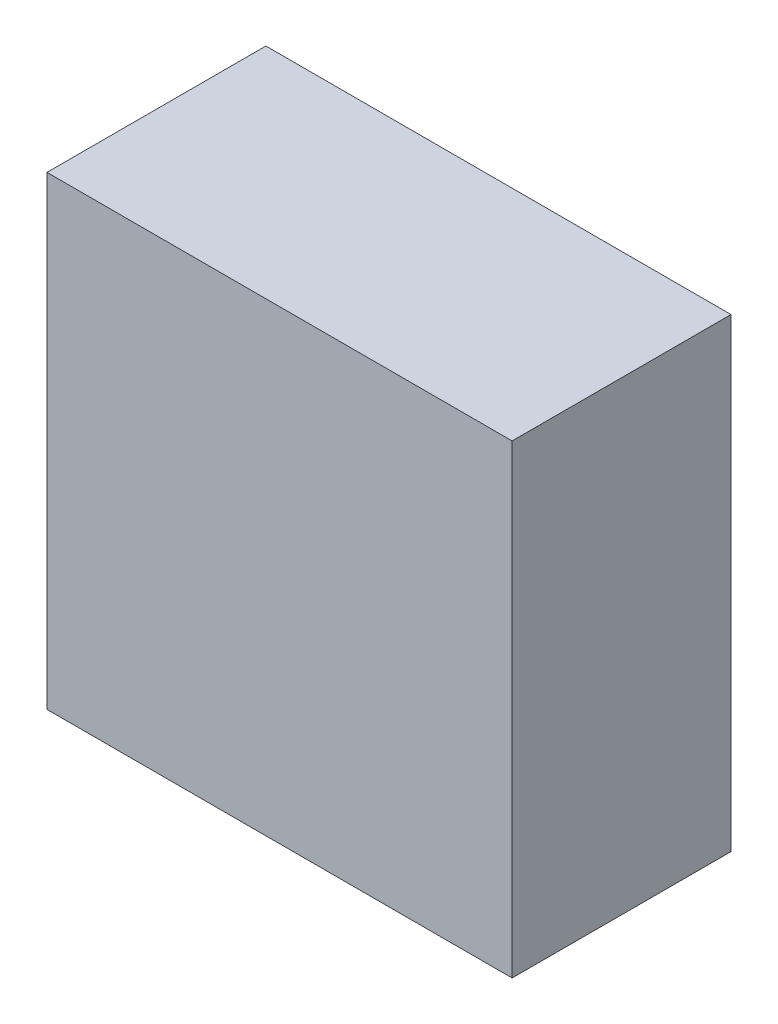
ISO-10303-21;
HEADER;
FILE_DESCRIPTION(('STEP AP214'),'2;1');
FILE_NAME('part.step','',(''),(''),'','','');
FILE_SCHEMA(('AUTOMOTIVE_DESIGN { 1 0 10303 214 1 1 1 1 }'));
ENDSEC;
DATA;
#1=APPLICATION_CONTEXT('core data for automotive mechanical design processes');
#2=APPLICATION_PROTOCOL_DEFINITION('international standard','automotive_design',2000,#1);
#3=PRODUCT_CONTEXT('',#1,'mechanical');
#4=PRODUCT('Part','Part','',(#3));
#5=PRODUCT_RELATED_PRODUCT_CATEGORY('part','',(#4));
#6=PRODUCT_DEFINITION_FORMATION('','',#4);
#7=PRODUCT_DEFINITION_CONTEXT('part definition',#1,'design');
#8=PRODUCT_DEFINITION('design','',#6,#7);
#9=PRODUCT_DEFINITION_SHAPE('','',#8);
#10=(LENGTH_UNIT() NAMED_UNIT(*) SI_UNIT(.MILLI.,.METRE.));
#11=(NAMED_UNIT(*) PLANE_ANGLE_UNIT() SI_UNIT($,.RADIAN.));
#12=(NAMED_UNIT(*) SI_UNIT($,.STERADIAN.) SOLID_ANGLE_UNIT());
#13=UNCERTAINTY_MEASURE_WITH_UNIT(LENGTH_MEASURE(1.E-05),#10,'distance_accuracy_value','');
#14=(GEOMETRIC_REPRESENTATION_CONTEXT(3) GLOBAL_UNCERTAINTY_ASSIGNED_CONTEXT((#13)) GLOBAL_UNIT_ASSIGNED_CONTEXT((#10,
#11,#12)) REPRESENTATION_CONTEXT('',''));
#15=CARTESIAN_POINT('',(0.,0.,0.));
#16=DIRECTION('',(0.,0.,1.));
#17=DIRECTION('',(1.,0.,0.));
#18=AXIS2_PLACEMENT_3D('',#15,#16,#17);
#19=CARTESIAN_POINT('',(-17.,17.,16.));
#20=DIRECTION('',(1.,0.,0.));
#21=DIRECTION('',(0.,0.,-1.));
#22=AXIS2_PLACEMENT_3D('',#19,#20,#21);
#23=PLANE('',#22);
#24=DIRECTION('',(0.,-1.,0.));
#25=VECTOR('',#24,1.);
#26=CARTESIAN_POINT('',(-17.,17.,0.));
#27=LINE('',#26,#25);
#28=CARTESIAN_POINT('',(-17.,17.,0.));
#29=VERTEX_POINT('',#28);
#30=CARTESIAN_POINT('',(-17.,-17.,0.));
#31=VERTEX_POINT('',#30);
#32=EDGE_CURVE('E101',#29,#31,#27,.T.);
#33=ORIENTED_EDGE('',*,*,#32,.T.);
#34=DIRECTION('',(0.,0.,-1.));
#35=VECTOR('',#34,1.);
#36=CARTESIAN_POINT('',(-17.,-17.,16.));
#37=LINE('',#36,#35);
#38=CARTESIAN_POINT('',(-17.,-17.,16.));
#39=VERTEX_POINT('',#38);
#40=EDGE_CURVE('E11',#39,#31,#37,.T.);
#41=ORIENTED_EDGE('',*,*,#40,.F.);
#42=DIRECTION('',(0.,-1.,0.));
#43=VECTOR('',#42,1.);
#44=CARTESIAN_POINT('',(-17.,17.,16.));
#45=LINE('',#44,#43);
#46=CARTESIAN_POINT('',(-17.,17.,16.));
#47=VERTEX_POINT('',#46);
#48=EDGE_CURVE('E89',#47,#39,#45,.T.);
#49=ORIENTED_EDGE('',*,*,#48,.F.);
#50=DIRECTION('',(0.,0.,-1.));
#51=VECTOR('',#50,1.);
#52=CARTESIAN_POINT('',(-17.,17.,16.));
#53=LINE('',#52,#51);
#54=EDGE_CURVE('E97',#47,#29,#53,.T.);
#55=ORIENTED_EDGE('',*,*,#54,.T.);
#56=EDGE_LOOP('',(#33,#41,#49,#55));
#57=FACE_BOUND('',#56,.T.);
#58=ADVANCED_FACE('F38',(#57),#23,.F.);
#59=CARTESIAN_POINT('',(-17.,-17.,16.));
#60=DIRECTION('',(0.,1.,0.));
#61=DIRECTION('',(0.,0.,1.));
#62=AXIS2_PLACEMENT_3D('',#59,#60,#61);
#63=PLANE('',#62);
#64=DIRECTION('',(1.,0.,0.));
#65=VECTOR('',#64,1.);
#66=CARTESIAN_POINT('',(-17.,-17.,0.));
#67=LINE('',#66,#65);
#68=CARTESIAN_POINT('',(17.,-17.,0.));
#69=VERTEX_POINT('',#68);
#70=EDGE_CURVE('E93',#31,#69,#67,.T.);
#71=ORIENTED_EDGE('',*,*,#70,.T.);
#72=DIRECTION('',(0.,0.,-1.));
#73=VECTOR('',#72,1.);
#74=CARTESIAN_POINT('',(17.,-17.,16.));
#75=LINE('',#74,#73);
#76=CARTESIAN_POINT('',(17.,-17.,16.));
#77=VERTEX_POINT('',#76);
#78=EDGE_CURVE('E46',#77,#69,#75,.T.);
#79=ORIENTED_EDGE('',*,*,#78,.F.);
#80=DIRECTION('',(1.,0.,0.));
#81=VECTOR('',#80,1.);
#82=CARTESIAN_POINT('',(-17.,-17.,16.));
#83=LINE('',#82,#81);
#84=EDGE_CURVE('E84',#39,#77,#83,.T.);
#85=ORIENTED_EDGE('',*,*,#84,.F.);
#86=ORIENTED_EDGE('',*,*,#40,.T.);
#87=EDGE_LOOP('',(#71,#79,#85,#86));
#88=FACE_BOUND('',#87,.T.);
#89=ADVANCED_FACE('F92',(#88),#63,.F.);
#90=CARTESIAN_POINT('',(17.,17.,16.));
#91=DIRECTION('',(-1.,0.,0.));
#92=DIRECTION('',(0.,0.,1.));
#93=AXIS2_PLACEMENT_3D('',#90,#91,#92);
#94=PLANE('',#93);
#95=DIRECTION('',(0.,1.,0.));
#96=VECTOR('',#95,1.);
#97=CARTESIAN_POINT('',(17.,17.,0.));
#98=LINE('',#97,#96);
#99=CARTESIAN_POINT('',(17.,17.,0.));
#100=VERTEX_POINT('',#99);
#101=EDGE_CURVE('E71',#69,#100,#98,.T.);
#102=ORIENTED_EDGE('',*,*,#101,.T.);
#103=DIRECTION('',(0.,0.,-1.));
#104=VECTOR('',#103,1.);
#105=CARTESIAN_POINT('',(17.,17.,16.));
#106=LINE('',#105,#104);
#107=CARTESIAN_POINT('',(17.,17.,16.));
#108=VERTEX_POINT('',#107);
#109=EDGE_CURVE('E94',#108,#100,#106,.T.);
#110=ORIENTED_EDGE('',*,*,#109,.F.);
#111=DIRECTION('',(0.,1.,0.));
#112=VECTOR('',#111,1.);
#113=CARTESIAN_POINT('',(17.,17.,16.));
#114=LINE('',#113,#112);
#115=EDGE_CURVE('E87',#77,#108,#114,.T.);
#116=ORIENTED_EDGE('',*,*,#115,.F.);
#117=ORIENTED_EDGE('',*,*,#78,.T.);
#118=EDGE_LOOP('',(#102,#110,#116,#117));
#119=FACE_BOUND('',#118,.T.);
#120=ADVANCED_FACE('F95',(#119),#94,.F.);
#121=CARTESIAN_POINT('',(-17.,17.,16.));
#122=DIRECTION('',(0.,-1.,0.));
#123=DIRECTION('',(0.,0.,-1.));
#124=AXIS2_PLACEMENT_3D('',#121,#122,#123);
#125=PLANE('',#124);
#126=DIRECTION('',(-1.,0.,0.));
#127=VECTOR('',#126,1.);
#128=CARTESIAN_POINT('',(-17.,17.,0.));
#129=LINE('',#128,#127);
#130=EDGE_CURVE('E77',#100,#29,#129,.T.);
#131=ORIENTED_EDGE('',*,*,#130,.T.);
#132=ORIENTED_EDGE('',*,*,#54,.F.);
#133=DIRECTION('',(-1.,0.,0.));
#134=VECTOR('',#133,1.);
#135=CARTESIAN_POINT('',(-17.,17.,16.));
#136=LINE('',#135,#134);
#137=EDGE_CURVE('E54',#108,#47,#136,.T.);
#138=ORIENTED_EDGE('',*,*,#137,.F.);
#139=ORIENTED_EDGE('',*,*,#109,.T.);
#140=EDGE_LOOP('',(#131,#132,#138,#139));
#141=FACE_BOUND('',#140,.T.);
#142=ADVANCED_FACE('F109',(#141),#125,.F.);
#143=CARTESIAN_POINT('',(0.,0.,16.));
#144=DIRECTION('',(0.,0.,1.));
#145=DIRECTION('',(1.,0.,0.));
#146=AXIS2_PLACEMENT_3D('',#143,#144,#145);
#147=PLANE('',#146);
#148=ORIENTED_EDGE('',*,*,#48,.T.);
#149=ORIENTED_EDGE('',*,*,#84,.T.);
#150=ORIENTED_EDGE('',*,*,#115,.T.);
#151=ORIENTED_EDGE('',*,*,#137,.T.);
#152=EDGE_LOOP('',(#148,#149,#150,#151));
#153=FACE_BOUND('',#152,.T.);
#154=ADVANCED_FACE('F85',(#153),#147,.T.);
#155=CARTESIAN_POINT('',(0.,0.,0.));
#156=DIRECTION('',(0.,0.,1.));
#157=DIRECTION('',(1.,0.,0.));
#158=AXIS2_PLACEMENT_3D('',#155,#156,#157);
#159=PLANE('',#158);
#160=CARTESIAN_POINT('',(0.,0.,0.));
#161=DIRECTION('',(0.,0.,-1.));
#162=DIRECTION('',(-1.,0.,0.));
#163=AXIS2_PLACEMENT_3D('',#160,#161,#162);
#164=CIRCLE('',#163,1.5);
#165=CARTESIAN_POINT('',(-1.5,0.,0.));
#166=VERTEX_POINT('',#165);
#167=EDGE_CURVE('E115',#166,#166,#164,.T.);
#168=ORIENTED_EDGE('',*,*,#167,.F.);
#169=EDGE_LOOP('',(#168));
#170=FACE_BOUND('',#169,.T.);
#171=ORIENTED_EDGE('',*,*,#32,.F.);
#172=ORIENTED_EDGE('',*,*,#130,.F.);
#173=ORIENTED_EDGE('',*,*,#101,.F.);
#174=ORIENTED_EDGE('',*,*,#70,.F.);
#175=EDGE_LOOP('',(#171,#172,#173,#174));
#176=FACE_BOUND('',#175,.T.);
#177=ADVANCED_FACE('F112',(#170,#176),#159,.F.);
#178=CARTESIAN_POINT('',(0.,0.,3.));
#179=DIRECTION('',(0.,0.,-1.));
#180=DIRECTION('',(-1.,0.,0.));
#181=AXIS2_PLACEMENT_3D('',#178,#179,#180);
#182=CYLINDRICAL_SURFACE('',#181,1.5);
#183=CARTESIAN_POINT('',(0.,0.,3.));
#184=DIRECTION('',(0.,0.,-1.));
#185=DIRECTION('',(-1.,0.,0.));
#186=AXIS2_PLACEMENT_3D('',#183,#184,#185);
#187=CIRCLE('',#186,1.5);
#188=CARTESIAN_POINT('',(-1.5,0.,3.));
#189=VERTEX_POINT('',#188);
#190=EDGE_CURVE('E104',#189,#189,#187,.T.);
#191=ORIENTED_EDGE('',*,*,#190,.F.);
#192=EDGE_LOOP('',(#191));
#193=FACE_BOUND('',#192,.T.);
#194=ORIENTED_EDGE('',*,*,#167,.T.);
#195=EDGE_LOOP('',(#194));
#196=FACE_BOUND('',#195,.T.);
#197=ADVANCED_FACE('F123',(#193,#196),#182,.F.);
#198=CARTESIAN_POINT('',(0.,0.,3.));
#199=DIRECTION('',(0.,0.,-1.));
#200=DIRECTION('',(-1.,0.,0.));
#201=AXIS2_PLACEMENT_3D('',#198,#199,#200);
#202=PLANE('',#201);
#203=ORIENTED_EDGE('',*,*,#190,.T.);
#204=EDGE_LOOP('',(#203));
#205=FACE_BOUND('',#204,.T.);
#206=ADVANCED_FACE('F121',(#205),#202,.T.);
#207=CLOSED_SHELL('',(#58,#89,#120,#142,#154,#177,#197,#206));
#208=MANIFOLD_SOLID_BREP('B2',#207);
#209=ADVANCED_BREP_SHAPE_REPRESENTATION('',(#18,#208),#14);
#210=SHAPE_DEFINITION_REPRESENTATION(#9,#209);
ENDSEC;
END-ISO-10303-21;
